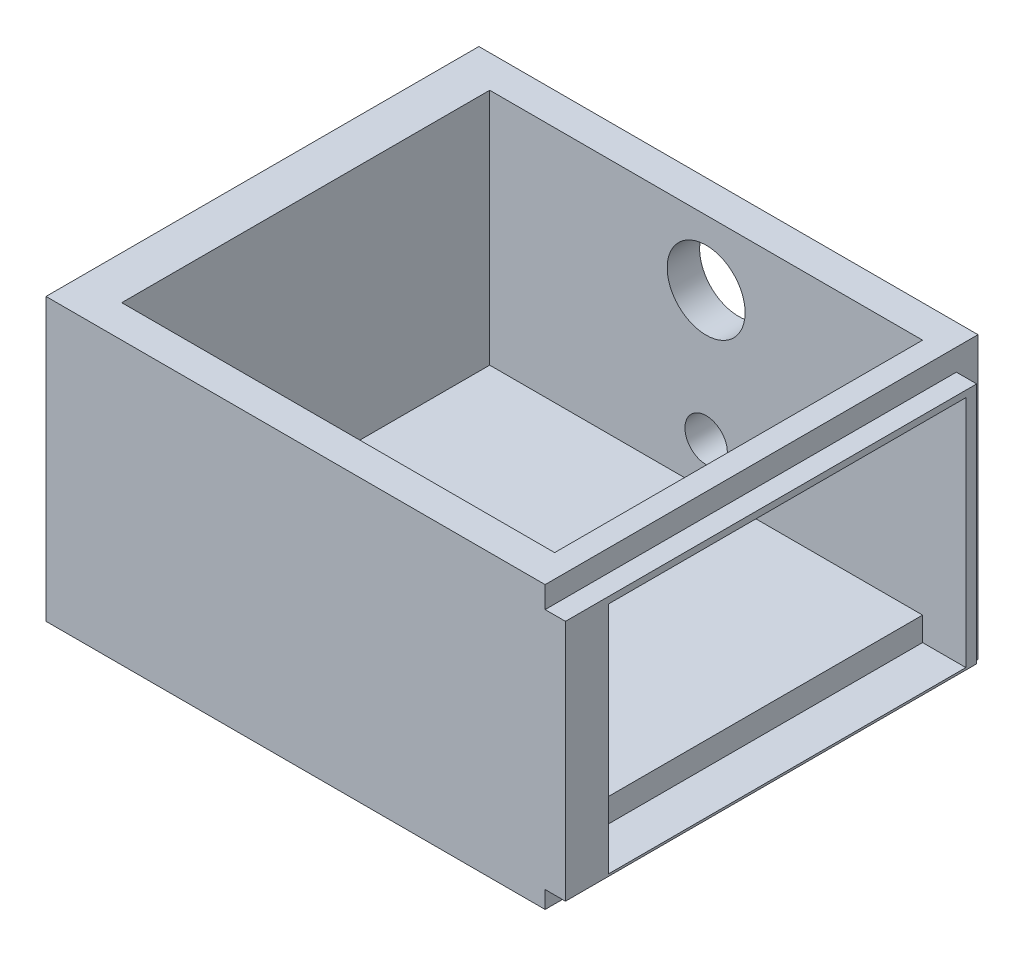
ISO-10303-21;
HEADER;
FILE_DESCRIPTION(('STEP AP214'),'2;1');
FILE_NAME('part.step','',(''),(''),'','','');
FILE_SCHEMA(('AUTOMOTIVE_DESIGN { 1 0 10303 214 1 1 1 1 }'));
ENDSEC;
DATA;
#1=APPLICATION_CONTEXT('core data for automotive mechanical design processes');
#2=APPLICATION_PROTOCOL_DEFINITION('international standard','automotive_design',2000,#1);
#3=PRODUCT_CONTEXT('',#1,'mechanical');
#4=PRODUCT('Part','Part','',(#3));
#5=PRODUCT_RELATED_PRODUCT_CATEGORY('part','',(#4));
#6=PRODUCT_DEFINITION_FORMATION('','',#4);
#7=PRODUCT_DEFINITION_CONTEXT('part definition',#1,'design');
#8=PRODUCT_DEFINITION('design','',#6,#7);
#9=PRODUCT_DEFINITION_SHAPE('','',#8);
#10=(LENGTH_UNIT() NAMED_UNIT(*) SI_UNIT(.MILLI.,.METRE.));
#11=(NAMED_UNIT(*) PLANE_ANGLE_UNIT() SI_UNIT($,.RADIAN.));
#12=(NAMED_UNIT(*) SI_UNIT($,.STERADIAN.) SOLID_ANGLE_UNIT());
#13=UNCERTAINTY_MEASURE_WITH_UNIT(LENGTH_MEASURE(1.E-05),#10,'distance_accuracy_value','');
#14=(GEOMETRIC_REPRESENTATION_CONTEXT(3) GLOBAL_UNCERTAINTY_ASSIGNED_CONTEXT((#13)) GLOBAL_UNIT_ASSIGNED_CONTEXT((#10,
#11,#12)) REPRESENTATION_CONTEXT('',''));
#15=CARTESIAN_POINT('',(0.,0.,0.));
#16=DIRECTION('',(0.,0.,1.));
#17=DIRECTION('',(1.,0.,0.));
#18=AXIS2_PLACEMENT_3D('',#15,#16,#17);
#19=CARTESIAN_POINT('',(60.,65.,50.));
#20=DIRECTION('',(-1.,0.,0.));
#21=DIRECTION('',(0.,0.,1.));
#22=AXIS2_PLACEMENT_3D('',#19,#20,#21);
#23=PLANE('',#22);
#24=DIRECTION('',(0.,0.,-1.));
#25=VECTOR('',#24,1.);
#26=CARTESIAN_POINT('',(60.,4.5,40.));
#27=LINE('',#26,#25);
#28=CARTESIAN_POINT('',(60.,4.5,40.));
#29=VERTEX_POINT('',#28);
#30=CARTESIAN_POINT('',(60.,4.5,-42.5));
#31=VERTEX_POINT('',#30);
#32=EDGE_CURVE('E183',#29,#31,#27,.T.);
#33=ORIENTED_EDGE('',*,*,#32,.F.);
#34=DIRECTION('',(0.,-1.,0.));
#35=VECTOR('',#34,1.);
#36=CARTESIAN_POINT('',(60.,58.5,40.));
#37=LINE('',#36,#35);
#38=CARTESIAN_POINT('',(60.,58.5,40.));
#39=VERTEX_POINT('',#38);
#40=EDGE_CURVE('E52',#39,#29,#37,.T.);
#41=ORIENTED_EDGE('',*,*,#40,.F.);
#42=DIRECTION('',(0.,0.,1.));
#43=VECTOR('',#42,1.);
#44=CARTESIAN_POINT('',(60.,58.5,40.));
#45=LINE('',#44,#43);
#46=CARTESIAN_POINT('',(60.,58.5,-42.5));
#47=VERTEX_POINT('',#46);
#48=EDGE_CURVE('E164',#47,#39,#45,.T.);
#49=ORIENTED_EDGE('',*,*,#48,.F.);
#50=DIRECTION('',(0.,1.,0.));
#51=VECTOR('',#50,1.);
#52=CARTESIAN_POINT('',(60.,58.5,-42.5));
#53=LINE('',#52,#51);
#54=EDGE_CURVE('E185',#31,#47,#53,.T.);
#55=ORIENTED_EDGE('',*,*,#54,.F.);
#56=EDGE_LOOP('',(#33,#41,#49,#55));
#57=FACE_BOUND('',#56,.T.);
#58=DIRECTION('',(0.,0.,1.));
#59=VECTOR('',#58,1.);
#60=CARTESIAN_POINT('',(60.,4.,-45.));
#61=LINE('',#60,#59);
#62=CARTESIAN_POINT('',(60.,4.,-45.));
#63=VERTEX_POINT('',#62);
#64=CARTESIAN_POINT('',(60.,4.,50.));
#65=VERTEX_POINT('',#64);
#66=EDGE_CURVE('E222',#63,#65,#61,.T.);
#67=ORIENTED_EDGE('',*,*,#66,.F.);
#68=DIRECTION('',(0.,-1.,0.));
#69=VECTOR('',#68,1.);
#70=CARTESIAN_POINT('',(60.,65.,-45.));
#71=LINE('',#70,#69);
#72=CARTESIAN_POINT('',(60.,60.,-45.));
#73=VERTEX_POINT('',#72);
#74=EDGE_CURVE('E192',#73,#63,#71,.T.);
#75=ORIENTED_EDGE('',*,*,#74,.F.);
#76=DIRECTION('',(0.,0.,1.));
#77=VECTOR('',#76,1.);
#78=CARTESIAN_POINT('',(60.,60.,-45.));
#79=LINE('',#78,#77);
#80=CARTESIAN_POINT('',(60.,60.,50.));
#81=VERTEX_POINT('',#80);
#82=EDGE_CURVE('E213',#73,#81,#79,.T.);
#83=ORIENTED_EDGE('',*,*,#82,.T.);
#84=DIRECTION('',(0.,-1.,0.));
#85=VECTOR('',#84,1.);
#86=CARTESIAN_POINT('',(60.,65.,50.));
#87=LINE('',#86,#85);
#88=EDGE_CURVE('E281',#81,#65,#87,.T.);
#89=ORIENTED_EDGE('',*,*,#88,.T.);
#90=EDGE_LOOP('',(#67,#75,#83,#89));
#91=FACE_BOUND('',#90,.T.);
#92=ADVANCED_FACE('F38',(#57,#91),#23,.F.);
#93=CARTESIAN_POINT('',(-60.,65.,-50.));
#94=DIRECTION('',(0.,0.,1.));
#95=DIRECTION('',(1.,0.,0.));
#96=AXIS2_PLACEMENT_3D('',#93,#94,#95);
#97=PLANE('',#96);
#98=CARTESIAN_POINT('',(0.,50.,-50.));
#99=DIRECTION('',(0.,0.,1.));
#100=DIRECTION('',(1.,0.,0.));
#101=AXIS2_PLACEMENT_3D('',#98,#99,#100);
#102=CIRCLE('',#101,9.);
#103=CARTESIAN_POINT('',(9.,50.,-50.));
#104=VERTEX_POINT('',#103);
#105=EDGE_CURVE('E240',#104,#104,#102,.T.);
#106=ORIENTED_EDGE('',*,*,#105,.T.);
#107=EDGE_LOOP('',(#106));
#108=FACE_BOUND('',#107,.T.);
#109=CARTESIAN_POINT('',(0.,20.,-50.));
#110=DIRECTION('',(0.,0.,1.));
#111=DIRECTION('',(1.,0.,0.));
#112=AXIS2_PLACEMENT_3D('',#109,#110,#111);
#113=CIRCLE('',#112,4.9);
#114=CARTESIAN_POINT('',(4.90000000000001,20.,-50.));
#115=VERTEX_POINT('',#114);
#116=EDGE_CURVE('E235',#115,#115,#113,.T.);
#117=ORIENTED_EDGE('',*,*,#116,.T.);
#118=EDGE_LOOP('',(#117));
#119=FACE_BOUND('',#118,.T.);
#120=DIRECTION('',(-1.,0.,0.));
#121=VECTOR('',#120,1.);
#122=CARTESIAN_POINT('',(-60.,65.,-50.));
#123=LINE('',#122,#121);
#124=CARTESIAN_POINT('',(55.3,65.,-50.));
#125=VERTEX_POINT('',#124);
#126=CARTESIAN_POINT('',(-60.,65.,-50.));
#127=VERTEX_POINT('',#126);
#128=EDGE_CURVE('E273',#125,#127,#123,.T.);
#129=ORIENTED_EDGE('',*,*,#128,.F.);
#130=DIRECTION('',(0.,1.,0.));
#131=VECTOR('',#130,1.);
#132=CARTESIAN_POINT('',(55.3,65.,-50.));
#133=LINE('',#132,#131);
#134=CARTESIAN_POINT('',(55.3,0.,-50.));
#135=VERTEX_POINT('',#134);
#136=EDGE_CURVE('E196',#135,#125,#133,.T.);
#137=ORIENTED_EDGE('',*,*,#136,.F.);
#138=DIRECTION('',(-1.,0.,0.));
#139=VECTOR('',#138,1.);
#140=CARTESIAN_POINT('',(-60.,0.,-50.));
#141=LINE('',#140,#139);
#142=CARTESIAN_POINT('',(-60.,0.,-50.));
#143=VERTEX_POINT('',#142);
#144=EDGE_CURVE('E267',#135,#143,#141,.T.);
#145=ORIENTED_EDGE('',*,*,#144,.T.);
#146=DIRECTION('',(0.,-1.,0.));
#147=VECTOR('',#146,1.);
#148=CARTESIAN_POINT('',(-60.,65.,-50.));
#149=LINE('',#148,#147);
#150=EDGE_CURVE('E11',#127,#143,#149,.T.);
#151=ORIENTED_EDGE('',*,*,#150,.F.);
#152=EDGE_LOOP('',(#129,#137,#145,#151));
#153=FACE_BOUND('',#152,.T.);
#154=ADVANCED_FACE('F308',(#108,#119,#153),#97,.F.);
#155=CARTESIAN_POINT('',(-60.,65.,50.));
#156=DIRECTION('',(1.,0.,0.));
#157=DIRECTION('',(0.,0.,-1.));
#158=AXIS2_PLACEMENT_3D('',#155,#156,#157);
#159=PLANE('',#158);
#160=DIRECTION('',(0.,0.,1.));
#161=VECTOR('',#160,1.);
#162=CARTESIAN_POINT('',(-60.,0.,50.));
#163=LINE('',#162,#161);
#164=CARTESIAN_POINT('',(-60.,0.,50.));
#165=VERTEX_POINT('',#164);
#166=EDGE_CURVE('E283',#143,#165,#163,.T.);
#167=ORIENTED_EDGE('',*,*,#166,.T.);
#168=DIRECTION('',(0.,-1.,0.));
#169=VECTOR('',#168,1.);
#170=CARTESIAN_POINT('',(-60.,65.,50.));
#171=LINE('',#170,#169);
#172=CARTESIAN_POINT('',(-60.,65.,50.));
#173=VERTEX_POINT('',#172);
#174=EDGE_CURVE('E45',#173,#165,#171,.T.);
#175=ORIENTED_EDGE('',*,*,#174,.F.);
#176=DIRECTION('',(0.,0.,1.));
#177=VECTOR('',#176,1.);
#178=CARTESIAN_POINT('',(-60.,65.,50.));
#179=LINE('',#178,#177);
#180=EDGE_CURVE('E275',#127,#173,#179,.T.);
#181=ORIENTED_EDGE('',*,*,#180,.F.);
#182=ORIENTED_EDGE('',*,*,#150,.T.);
#183=EDGE_LOOP('',(#167,#175,#181,#182));
#184=FACE_BOUND('',#183,.T.);
#185=ADVANCED_FACE('F345',(#184),#159,.F.);
#186=CARTESIAN_POINT('',(-60.,65.,50.));
#187=DIRECTION('',(0.,0.,-1.));
#188=DIRECTION('',(-1.,0.,0.));
#189=AXIS2_PLACEMENT_3D('',#186,#187,#188);
#190=PLANE('',#189);
#191=ORIENTED_EDGE('',*,*,#88,.F.);
#192=DIRECTION('',(1.,0.,0.));
#193=VECTOR('',#192,1.);
#194=CARTESIAN_POINT('',(60.,60.,50.));
#195=LINE('',#194,#193);
#196=CARTESIAN_POINT('',(55.3,60.,50.));
#197=VERTEX_POINT('',#196);
#198=EDGE_CURVE('E207',#197,#81,#195,.T.);
#199=ORIENTED_EDGE('',*,*,#198,.F.);
#200=DIRECTION('',(0.,-1.,0.));
#201=VECTOR('',#200,1.);
#202=CARTESIAN_POINT('',(55.3,65.,50.));
#203=LINE('',#202,#201);
#204=CARTESIAN_POINT('',(55.3,65.,50.));
#205=VERTEX_POINT('',#204);
#206=EDGE_CURVE('E208',#205,#197,#203,.T.);
#207=ORIENTED_EDGE('',*,*,#206,.F.);
#208=DIRECTION('',(1.,0.,0.));
#209=VECTOR('',#208,1.);
#210=CARTESIAN_POINT('',(-60.,65.,50.));
#211=LINE('',#210,#209);
#212=EDGE_CURVE('E278',#173,#205,#211,.T.);
#213=ORIENTED_EDGE('',*,*,#212,.F.);
#214=ORIENTED_EDGE('',*,*,#174,.T.);
#215=DIRECTION('',(1.,0.,0.));
#216=VECTOR('',#215,1.);
#217=CARTESIAN_POINT('',(-60.,0.,50.));
#218=LINE('',#217,#216);
#219=CARTESIAN_POINT('',(55.3,0.,50.));
#220=VERTEX_POINT('',#219);
#221=EDGE_CURVE('E276',#165,#220,#218,.T.);
#222=ORIENTED_EDGE('',*,*,#221,.T.);
#223=DIRECTION('',(0.,-1.,0.));
#224=VECTOR('',#223,1.);
#225=CARTESIAN_POINT('',(55.3,4.,50.));
#226=LINE('',#225,#224);
#227=CARTESIAN_POINT('',(55.3,4.,50.));
#228=VERTEX_POINT('',#227);
#229=EDGE_CURVE('E223',#228,#220,#226,.T.);
#230=ORIENTED_EDGE('',*,*,#229,.F.);
#231=DIRECTION('',(-1.,0.,0.));
#232=VECTOR('',#231,1.);
#233=CARTESIAN_POINT('',(60.,4.,50.));
#234=LINE('',#233,#232);
#235=EDGE_CURVE('E202',#65,#228,#234,.T.);
#236=ORIENTED_EDGE('',*,*,#235,.F.);
#237=EDGE_LOOP('',(#191,#199,#207,#213,#214,#222,#230,#236));
#238=FACE_BOUND('',#237,.T.);
#239=ADVANCED_FACE('F294',(#238),#190,.F.);
#240=CARTESIAN_POINT('',(0.,65.,0.));
#241=DIRECTION('',(0.,-1.,0.));
#242=DIRECTION('',(0.,0.,-1.));
#243=AXIS2_PLACEMENT_3D('',#240,#241,#242);
#244=PLANE('',#243);
#245=DIRECTION('',(-1.,0.,0.));
#246=VECTOR('',#245,1.);
#247=CARTESIAN_POINT('',(-50.,65.,-42.5));
#248=LINE('',#247,#246);
#249=CARTESIAN_POINT('',(50.,65.,-42.5));
#250=VERTEX_POINT('',#249);
#251=CARTESIAN_POINT('',(-50.,65.,-42.5));
#252=VERTEX_POINT('',#251);
#253=EDGE_CURVE('E257',#250,#252,#248,.T.);
#254=ORIENTED_EDGE('',*,*,#253,.F.);
#255=DIRECTION('',(0.,0.,-1.));
#256=VECTOR('',#255,1.);
#257=CARTESIAN_POINT('',(50.,65.,42.5));
#258=LINE('',#257,#256);
#259=CARTESIAN_POINT('',(50.,65.,42.5));
#260=VERTEX_POINT('',#259);
#261=EDGE_CURVE('E243',#260,#250,#258,.T.);
#262=ORIENTED_EDGE('',*,*,#261,.F.);
#263=DIRECTION('',(1.,0.,0.));
#264=VECTOR('',#263,1.);
#265=CARTESIAN_POINT('',(-50.,65.,42.5));
#266=LINE('',#265,#264);
#267=CARTESIAN_POINT('',(-50.,65.,42.5));
#268=VERTEX_POINT('',#267);
#269=EDGE_CURVE('E262',#268,#260,#266,.T.);
#270=ORIENTED_EDGE('',*,*,#269,.F.);
#271=DIRECTION('',(0.,0.,1.));
#272=VECTOR('',#271,1.);
#273=CARTESIAN_POINT('',(-50.,65.,42.5));
#274=LINE('',#273,#272);
#275=EDGE_CURVE('E259',#252,#268,#274,.T.);
#276=ORIENTED_EDGE('',*,*,#275,.F.);
#277=EDGE_LOOP('',(#254,#262,#270,#276));
#278=FACE_BOUND('',#277,.T.);
#279=DIRECTION('',(0.,0.,1.));
#280=VECTOR('',#279,1.);
#281=CARTESIAN_POINT('',(55.3,65.,-45.));
#282=LINE('',#281,#280);
#283=EDGE_CURVE('E206',#125,#205,#282,.T.);
#284=ORIENTED_EDGE('',*,*,#283,.F.);
#285=ORIENTED_EDGE('',*,*,#128,.T.);
#286=ORIENTED_EDGE('',*,*,#180,.T.);
#287=ORIENTED_EDGE('',*,*,#212,.T.);
#288=EDGE_LOOP('',(#284,#285,#286,#287));
#289=FACE_BOUND('',#288,.T.);
#290=ADVANCED_FACE('F311',(#278,#289),#244,.F.);
#291=CARTESIAN_POINT('',(0.,0.,0.));
#292=DIRECTION('',(0.,-1.,0.));
#293=DIRECTION('',(0.,0.,-1.));
#294=AXIS2_PLACEMENT_3D('',#291,#292,#293);
#295=PLANE('',#294);
#296=ORIENTED_EDGE('',*,*,#144,.F.);
#297=DIRECTION('',(0.,0.,1.));
#298=VECTOR('',#297,1.);
#299=CARTESIAN_POINT('',(55.3,0.,-45.));
#300=LINE('',#299,#298);
#301=EDGE_CURVE('E211',#135,#220,#300,.T.);
#302=ORIENTED_EDGE('',*,*,#301,.T.);
#303=ORIENTED_EDGE('',*,*,#221,.F.);
#304=ORIENTED_EDGE('',*,*,#166,.F.);
#305=EDGE_LOOP('',(#296,#302,#303,#304));
#306=FACE_BOUND('',#305,.T.);
#307=ADVANCED_FACE('F302',(#306),#295,.T.);
#308=CARTESIAN_POINT('',(50.,10.,42.5));
#309=DIRECTION('',(1.,0.,0.));
#310=DIRECTION('',(0.,0.,-1.));
#311=AXIS2_PLACEMENT_3D('',#308,#309,#310);
#312=PLANE('',#311);
#313=DIRECTION('',(0.,0.,1.));
#314=VECTOR('',#313,1.);
#315=CARTESIAN_POINT('',(50.,58.5,40.));
#316=LINE('',#315,#314);
#317=CARTESIAN_POINT('',(50.,58.5,-42.5));
#318=VERTEX_POINT('',#317);
#319=CARTESIAN_POINT('',(50.,58.5,40.));
#320=VERTEX_POINT('',#319);
#321=EDGE_CURVE('E172',#318,#320,#316,.T.);
#322=ORIENTED_EDGE('',*,*,#321,.T.);
#323=DIRECTION('',(0.,-1.,0.));
#324=VECTOR('',#323,1.);
#325=CARTESIAN_POINT('',(50.,58.5,40.));
#326=LINE('',#325,#324);
#327=CARTESIAN_POINT('',(50.,10.,40.));
#328=VERTEX_POINT('',#327);
#329=EDGE_CURVE('E163',#320,#328,#326,.T.);
#330=ORIENTED_EDGE('',*,*,#329,.T.);
#331=DIRECTION('',(0.,0.,-1.));
#332=VECTOR('',#331,1.);
#333=CARTESIAN_POINT('',(50.,10.,42.5));
#334=LINE('',#333,#332);
#335=CARTESIAN_POINT('',(50.,10.,42.5));
#336=VERTEX_POINT('',#335);
#337=EDGE_CURVE('E244',#336,#328,#334,.T.);
#338=ORIENTED_EDGE('',*,*,#337,.F.);
#339=DIRECTION('',(0.,1.,0.));
#340=VECTOR('',#339,1.);
#341=CARTESIAN_POINT('',(50.,10.,42.5));
#342=LINE('',#341,#340);
#343=EDGE_CURVE('E265',#336,#260,#342,.T.);
#344=ORIENTED_EDGE('',*,*,#343,.T.);
#345=ORIENTED_EDGE('',*,*,#261,.T.);
#346=DIRECTION('',(0.,1.,0.));
#347=VECTOR('',#346,1.);
#348=CARTESIAN_POINT('',(50.,10.,-42.5));
#349=LINE('',#348,#347);
#350=EDGE_CURVE('E60',#318,#250,#349,.T.);
#351=ORIENTED_EDGE('',*,*,#350,.F.);
#352=EDGE_LOOP('',(#322,#330,#338,#344,#345,#351));
#353=FACE_BOUND('',#352,.T.);
#354=ADVANCED_FACE('F357',(#353),#312,.F.);
#355=CARTESIAN_POINT('',(-50.,10.,42.5));
#356=DIRECTION('',(0.,0.,1.));
#357=DIRECTION('',(1.,0.,0.));
#358=AXIS2_PLACEMENT_3D('',#355,#356,#357);
#359=PLANE('',#358);
#360=ORIENTED_EDGE('',*,*,#269,.T.);
#361=ORIENTED_EDGE('',*,*,#343,.F.);
#362=DIRECTION('',(1.,0.,0.));
#363=VECTOR('',#362,1.);
#364=CARTESIAN_POINT('',(-50.,10.,42.5));
#365=LINE('',#364,#363);
#366=CARTESIAN_POINT('',(-50.,10.,42.5));
#367=VERTEX_POINT('',#366);
#368=EDGE_CURVE('E253',#367,#336,#365,.T.);
#369=ORIENTED_EDGE('',*,*,#368,.F.);
#370=DIRECTION('',(0.,1.,0.));
#371=VECTOR('',#370,1.);
#372=CARTESIAN_POINT('',(-50.,10.,42.5));
#373=LINE('',#372,#371);
#374=EDGE_CURVE('E268',#367,#268,#373,.T.);
#375=ORIENTED_EDGE('',*,*,#374,.T.);
#376=EDGE_LOOP('',(#360,#361,#369,#375));
#377=FACE_BOUND('',#376,.T.);
#378=ADVANCED_FACE('F369',(#377),#359,.F.);
#379=CARTESIAN_POINT('',(-50.,10.,42.5));
#380=DIRECTION('',(-1.,0.,0.));
#381=DIRECTION('',(0.,0.,1.));
#382=AXIS2_PLACEMENT_3D('',#379,#380,#381);
#383=PLANE('',#382);
#384=ORIENTED_EDGE('',*,*,#275,.T.);
#385=ORIENTED_EDGE('',*,*,#374,.F.);
#386=DIRECTION('',(0.,0.,1.));
#387=VECTOR('',#386,1.);
#388=CARTESIAN_POINT('',(-50.,10.,42.5));
#389=LINE('',#388,#387);
#390=CARTESIAN_POINT('',(-50.,10.,-42.5));
#391=VERTEX_POINT('',#390);
#392=EDGE_CURVE('E250',#391,#367,#389,.T.);
#393=ORIENTED_EDGE('',*,*,#392,.F.);
#394=DIRECTION('',(0.,1.,0.));
#395=VECTOR('',#394,1.);
#396=CARTESIAN_POINT('',(-50.,10.,-42.5));
#397=LINE('',#396,#395);
#398=EDGE_CURVE('E270',#391,#252,#397,.T.);
#399=ORIENTED_EDGE('',*,*,#398,.T.);
#400=EDGE_LOOP('',(#384,#385,#393,#399));
#401=FACE_BOUND('',#400,.T.);
#402=ADVANCED_FACE('F367',(#401),#383,.F.);
#403=CARTESIAN_POINT('',(-50.,10.,-42.5));
#404=DIRECTION('',(0.,0.,-1.));
#405=DIRECTION('',(-1.,0.,0.));
#406=AXIS2_PLACEMENT_3D('',#403,#404,#405);
#407=PLANE('',#406);
#408=CARTESIAN_POINT('',(0.,50.,-42.5));
#409=DIRECTION('',(0.,0.,1.));
#410=DIRECTION('',(1.,0.,0.));
#411=AXIS2_PLACEMENT_3D('',#408,#409,#410);
#412=CIRCLE('',#411,9.);
#413=CARTESIAN_POINT('',(9.,50.,-42.5));
#414=VERTEX_POINT('',#413);
#415=EDGE_CURVE('E232',#414,#414,#412,.T.);
#416=ORIENTED_EDGE('',*,*,#415,.F.);
#417=EDGE_LOOP('',(#416));
#418=FACE_BOUND('',#417,.T.);
#419=CARTESIAN_POINT('',(0.,20.,-42.5));
#420=DIRECTION('',(0.,0.,1.));
#421=DIRECTION('',(1.,0.,0.));
#422=AXIS2_PLACEMENT_3D('',#419,#420,#421);
#423=CIRCLE('',#422,4.9);
#424=CARTESIAN_POINT('',(4.90000000000001,20.,-42.5));
#425=VERTEX_POINT('',#424);
#426=EDGE_CURVE('E216',#425,#425,#423,.T.);
#427=ORIENTED_EDGE('',*,*,#426,.F.);
#428=EDGE_LOOP('',(#427));
#429=FACE_BOUND('',#428,.T.);
#430=ORIENTED_EDGE('',*,*,#253,.T.);
#431=ORIENTED_EDGE('',*,*,#398,.F.);
#432=DIRECTION('',(-1.,0.,0.));
#433=VECTOR('',#432,1.);
#434=CARTESIAN_POINT('',(-50.,10.,-42.5));
#435=LINE('',#434,#433);
#436=CARTESIAN_POINT('',(50.,10.,-42.5));
#437=VERTEX_POINT('',#436);
#438=EDGE_CURVE('E247',#437,#391,#435,.T.);
#439=ORIENTED_EDGE('',*,*,#438,.F.);
#440=DIRECTION('',(0.,1.,0.));
#441=VECTOR('',#440,1.);
#442=CARTESIAN_POINT('',(50.,58.5,-42.5));
#443=LINE('',#442,#441);
#444=CARTESIAN_POINT('',(50.,4.5,-42.5));
#445=VERTEX_POINT('',#444);
#446=EDGE_CURVE('E176',#445,#437,#443,.T.);
#447=ORIENTED_EDGE('',*,*,#446,.F.);
#448=DIRECTION('',(1.,0.,0.));
#449=VECTOR('',#448,1.);
#450=CARTESIAN_POINT('',(50.,4.5,-42.5));
#451=LINE('',#450,#449);
#452=EDGE_CURVE('E171',#445,#31,#451,.T.);
#453=ORIENTED_EDGE('',*,*,#452,.T.);
#454=ORIENTED_EDGE('',*,*,#54,.T.);
#455=DIRECTION('',(1.,0.,0.));
#456=VECTOR('',#455,1.);
#457=CARTESIAN_POINT('',(50.,58.5,-42.5));
#458=LINE('',#457,#456);
#459=EDGE_CURVE('E193',#318,#47,#458,.T.);
#460=ORIENTED_EDGE('',*,*,#459,.F.);
#461=ORIENTED_EDGE('',*,*,#350,.T.);
#462=EDGE_LOOP('',(#430,#431,#439,#447,#453,#454,#460,#461));
#463=FACE_BOUND('',#462,.T.);
#464=ADVANCED_FACE('F349',(#418,#429,#463),#407,.F.);
#465=CARTESIAN_POINT('',(0.,10.,0.));
#466=DIRECTION('',(0.,-1.,0.));
#467=DIRECTION('',(0.,0.,-1.));
#468=AXIS2_PLACEMENT_3D('',#465,#466,#467);
#469=PLANE('',#468);
#470=ORIENTED_EDGE('',*,*,#337,.T.);
#471=EDGE_CURVE('E160',#328,#437,#334,.T.);
#472=ORIENTED_EDGE('',*,*,#471,.T.);
#473=ORIENTED_EDGE('',*,*,#438,.T.);
#474=ORIENTED_EDGE('',*,*,#392,.T.);
#475=ORIENTED_EDGE('',*,*,#368,.T.);
#476=EDGE_LOOP('',(#470,#472,#473,#474,#475));
#477=FACE_BOUND('',#476,.T.);
#478=ADVANCED_FACE('F353',(#477),#469,.F.);
#479=CARTESIAN_POINT('',(0.,20.,-72.5));
#480=DIRECTION('',(0.,0.,1.));
#481=DIRECTION('',(1.,0.,0.));
#482=AXIS2_PLACEMENT_3D('',#479,#480,#481);
#483=CYLINDRICAL_SURFACE('',#482,4.9);
#484=ORIENTED_EDGE('',*,*,#426,.T.);
#485=EDGE_LOOP('',(#484));
#486=FACE_BOUND('',#485,.T.);
#487=ORIENTED_EDGE('',*,*,#116,.F.);
#488=EDGE_LOOP('',(#487));
#489=FACE_BOUND('',#488,.T.);
#490=ADVANCED_FACE('F336',(#486,#489),#483,.F.);
#491=CARTESIAN_POINT('',(0.,50.,-72.5));
#492=DIRECTION('',(0.,0.,1.));
#493=DIRECTION('',(1.,0.,0.));
#494=AXIS2_PLACEMENT_3D('',#491,#492,#493);
#495=CYLINDRICAL_SURFACE('',#494,9.);
#496=ORIENTED_EDGE('',*,*,#415,.T.);
#497=EDGE_LOOP('',(#496));
#498=FACE_BOUND('',#497,.T.);
#499=ORIENTED_EDGE('',*,*,#105,.F.);
#500=EDGE_LOOP('',(#499));
#501=FACE_BOUND('',#500,.T.);
#502=ADVANCED_FACE('F329',(#498,#501),#495,.F.);
#503=CARTESIAN_POINT('',(60.,4.,-45.));
#504=DIRECTION('',(0.,1.,0.));
#505=DIRECTION('',(0.,0.,1.));
#506=AXIS2_PLACEMENT_3D('',#503,#504,#505);
#507=PLANE('',#506);
#508=ORIENTED_EDGE('',*,*,#235,.T.);
#509=DIRECTION('',(0.,0.,1.));
#510=VECTOR('',#509,1.);
#511=CARTESIAN_POINT('',(55.3,4.,-45.));
#512=LINE('',#511,#510);
#513=CARTESIAN_POINT('',(55.3,4.,-45.));
#514=VERTEX_POINT('',#513);
#515=EDGE_CURVE('E229',#514,#228,#512,.T.);
#516=ORIENTED_EDGE('',*,*,#515,.F.);
#517=DIRECTION('',(-1.,0.,0.));
#518=VECTOR('',#517,1.);
#519=CARTESIAN_POINT('',(60.,4.,-45.));
#520=LINE('',#519,#518);
#521=EDGE_CURVE('E220',#63,#514,#520,.T.);
#522=ORIENTED_EDGE('',*,*,#521,.F.);
#523=ORIENTED_EDGE('',*,*,#66,.T.);
#524=EDGE_LOOP('',(#508,#516,#522,#523));
#525=FACE_BOUND('',#524,.T.);
#526=ADVANCED_FACE('F327',(#525),#507,.F.);
#527=CARTESIAN_POINT('',(60.,60.,-45.));
#528=DIRECTION('',(0.,-1.,0.));
#529=DIRECTION('',(0.,0.,-1.));
#530=AXIS2_PLACEMENT_3D('',#527,#528,#529);
#531=PLANE('',#530);
#532=ORIENTED_EDGE('',*,*,#198,.T.);
#533=ORIENTED_EDGE('',*,*,#82,.F.);
#534=DIRECTION('',(1.,0.,0.));
#535=VECTOR('',#534,1.);
#536=CARTESIAN_POINT('',(60.,60.,-45.));
#537=LINE('',#536,#535);
#538=CARTESIAN_POINT('',(55.3,60.,-45.));
#539=VERTEX_POINT('',#538);
#540=EDGE_CURVE('E204',#539,#73,#537,.T.);
#541=ORIENTED_EDGE('',*,*,#540,.F.);
#542=DIRECTION('',(0.,0.,1.));
#543=VECTOR('',#542,1.);
#544=CARTESIAN_POINT('',(55.3,60.,-45.));
#545=LINE('',#544,#543);
#546=EDGE_CURVE('E217',#539,#197,#545,.T.);
#547=ORIENTED_EDGE('',*,*,#546,.T.);
#548=EDGE_LOOP('',(#532,#533,#541,#547));
#549=FACE_BOUND('',#548,.T.);
#550=ADVANCED_FACE('F317',(#549),#531,.F.);
#551=CARTESIAN_POINT('',(55.3,65.,-45.));
#552=DIRECTION('',(-1.,0.,0.));
#553=DIRECTION('',(0.,0.,1.));
#554=AXIS2_PLACEMENT_3D('',#551,#552,#553);
#555=PLANE('',#554);
#556=ORIENTED_EDGE('',*,*,#206,.T.);
#557=ORIENTED_EDGE('',*,*,#546,.F.);
#558=DIRECTION('',(0.,-1.,0.));
#559=VECTOR('',#558,1.);
#560=CARTESIAN_POINT('',(55.3,65.,-45.));
#561=LINE('',#560,#559);
#562=EDGE_CURVE('E199',#539,#514,#561,.T.);
#563=ORIENTED_EDGE('',*,*,#562,.T.);
#564=ORIENTED_EDGE('',*,*,#515,.T.);
#565=ORIENTED_EDGE('',*,*,#229,.T.);
#566=ORIENTED_EDGE('',*,*,#301,.F.);
#567=ORIENTED_EDGE('',*,*,#136,.T.);
#568=ORIENTED_EDGE('',*,*,#283,.T.);
#569=EDGE_LOOP('',(#556,#557,#563,#564,#565,#566,#567,#568));
#570=FACE_BOUND('',#569,.T.);
#571=ADVANCED_FACE('F305',(#570),#555,.F.);
#572=CARTESIAN_POINT('',(55.3,65.,-45.));
#573=DIRECTION('',(0.,0.,1.));
#574=DIRECTION('',(1.,0.,0.));
#575=AXIS2_PLACEMENT_3D('',#572,#573,#574);
#576=PLANE('',#575);
#577=ORIENTED_EDGE('',*,*,#562,.F.);
#578=ORIENTED_EDGE('',*,*,#540,.T.);
#579=ORIENTED_EDGE('',*,*,#74,.T.);
#580=ORIENTED_EDGE('',*,*,#521,.T.);
#581=EDGE_LOOP('',(#577,#578,#579,#580));
#582=FACE_BOUND('',#581,.T.);
#583=ADVANCED_FACE('F324',(#582),#576,.F.);
#584=CARTESIAN_POINT('',(50.,0.,0.));
#585=DIRECTION('',(1.,0.,0.));
#586=DIRECTION('',(0.,0.,-1.));
#587=AXIS2_PLACEMENT_3D('',#584,#585,#586);
#588=PLANE('',#587);
#589=ORIENTED_EDGE('',*,*,#471,.F.);
#590=CARTESIAN_POINT('',(50.,4.5,40.));
#591=VERTEX_POINT('',#590);
#592=EDGE_CURVE('E155',#328,#591,#326,.T.);
#593=ORIENTED_EDGE('',*,*,#592,.T.);
#594=DIRECTION('',(0.,0.,-1.));
#595=VECTOR('',#594,1.);
#596=CARTESIAN_POINT('',(50.,4.5,40.));
#597=LINE('',#596,#595);
#598=EDGE_CURVE('E158',#591,#445,#597,.T.);
#599=ORIENTED_EDGE('',*,*,#598,.T.);
#600=ORIENTED_EDGE('',*,*,#446,.T.);
#601=EDGE_LOOP('',(#589,#593,#599,#600));
#602=FACE_BOUND('',#601,.T.);
#603=ADVANCED_FACE('F156',(#602),#588,.T.);
#604=CARTESIAN_POINT('',(50.,58.5,40.));
#605=DIRECTION('',(0.,0.,1.));
#606=DIRECTION('',(1.,0.,0.));
#607=AXIS2_PLACEMENT_3D('',#604,#605,#606);
#608=PLANE('',#607);
#609=ORIENTED_EDGE('',*,*,#40,.T.);
#610=DIRECTION('',(1.,0.,0.));
#611=VECTOR('',#610,1.);
#612=CARTESIAN_POINT('',(50.,4.5,40.));
#613=LINE('',#612,#611);
#614=EDGE_CURVE('E166',#591,#29,#613,.T.);
#615=ORIENTED_EDGE('',*,*,#614,.F.);
#616=ORIENTED_EDGE('',*,*,#592,.F.);
#617=ORIENTED_EDGE('',*,*,#329,.F.);
#618=DIRECTION('',(1.,0.,0.));
#619=VECTOR('',#618,1.);
#620=CARTESIAN_POINT('',(50.,58.5,40.));
#621=LINE('',#620,#619);
#622=EDGE_CURVE('E190',#320,#39,#621,.T.);
#623=ORIENTED_EDGE('',*,*,#622,.T.);
#624=EDGE_LOOP('',(#609,#615,#616,#617,#623));
#625=FACE_BOUND('',#624,.T.);
#626=ADVANCED_FACE('F167',(#625),#608,.F.);
#627=CARTESIAN_POINT('',(50.,58.5,40.));
#628=DIRECTION('',(0.,1.,0.));
#629=DIRECTION('',(0.,0.,1.));
#630=AXIS2_PLACEMENT_3D('',#627,#628,#629);
#631=PLANE('',#630);
#632=ORIENTED_EDGE('',*,*,#48,.T.);
#633=ORIENTED_EDGE('',*,*,#622,.F.);
#634=ORIENTED_EDGE('',*,*,#321,.F.);
#635=ORIENTED_EDGE('',*,*,#459,.T.);
#636=EDGE_LOOP('',(#632,#633,#634,#635));
#637=FACE_BOUND('',#636,.T.);
#638=ADVANCED_FACE('F359',(#637),#631,.F.);
#639=CARTESIAN_POINT('',(50.,4.5,40.));
#640=DIRECTION('',(0.,-1.,0.));
#641=DIRECTION('',(0.,0.,-1.));
#642=AXIS2_PLACEMENT_3D('',#639,#640,#641);
#643=PLANE('',#642);
#644=ORIENTED_EDGE('',*,*,#32,.T.);
#645=ORIENTED_EDGE('',*,*,#452,.F.);
#646=ORIENTED_EDGE('',*,*,#598,.F.);
#647=ORIENTED_EDGE('',*,*,#614,.T.);
#648=EDGE_LOOP('',(#644,#645,#646,#647));
#649=FACE_BOUND('',#648,.T.);
#650=ADVANCED_FACE('F174',(#649),#643,.F.);
#651=CLOSED_SHELL('',(#92,#154,#185,#239,#290,#307,#354,#378,#402,#464,#478,#490,#502,#526,#550,
#571,#583,#603,#626,#638,#650));
#652=MANIFOLD_SOLID_BREP('B2',#651);
#653=ADVANCED_BREP_SHAPE_REPRESENTATION('',(#18,#652),#14);
#654=SHAPE_DEFINITION_REPRESENTATION(#9,#653);
ENDSEC;
END-ISO-10303-21;
